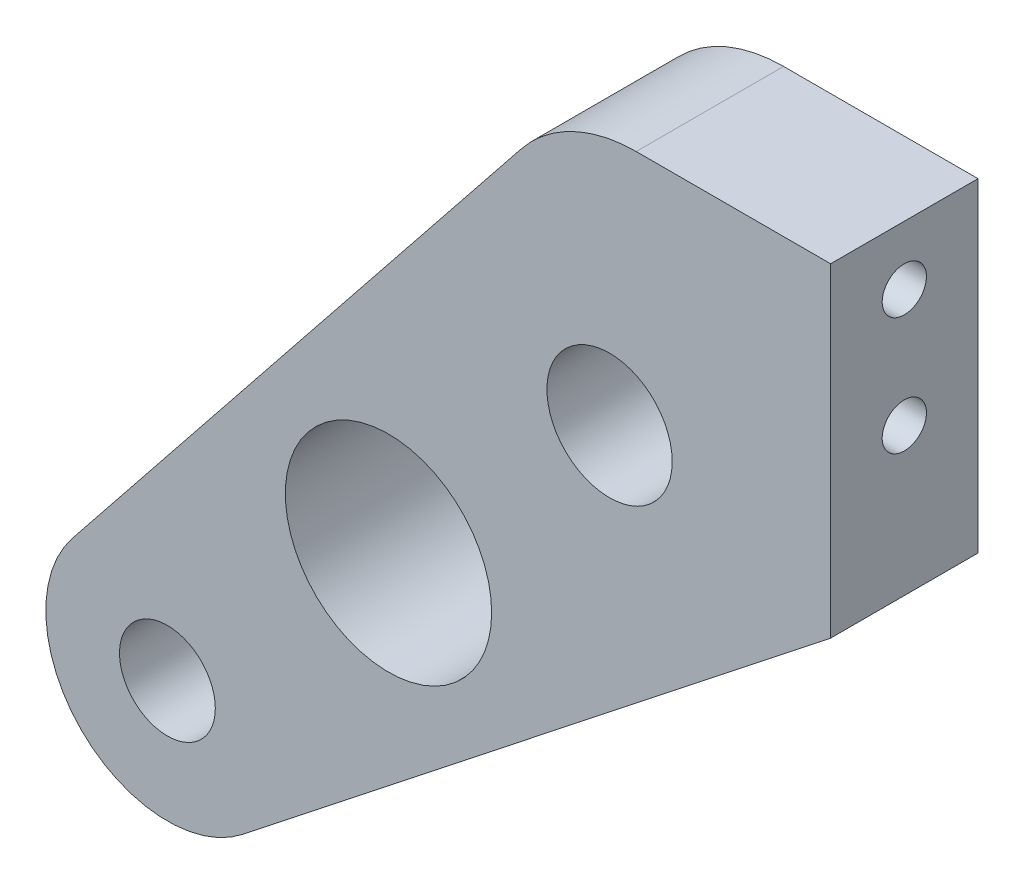
ISO-10303-21;
HEADER;
FILE_DESCRIPTION(('STEP AP214'),'2;1');
FILE_NAME('part.step','',(''),(''),'','','');
FILE_SCHEMA(('AUTOMOTIVE_DESIGN { 1 0 10303 214 1 1 1 1 }'));
ENDSEC;
DATA;
#1=APPLICATION_CONTEXT('core data for automotive mechanical design processes');
#2=APPLICATION_PROTOCOL_DEFINITION('international standard','automotive_design',2000,#1);
#3=PRODUCT_CONTEXT('',#1,'mechanical');
#4=PRODUCT('Part','Part','',(#3));
#5=PRODUCT_RELATED_PRODUCT_CATEGORY('part','',(#4));
#6=PRODUCT_DEFINITION_FORMATION('','',#4);
#7=PRODUCT_DEFINITION_CONTEXT('part definition',#1,'design');
#8=PRODUCT_DEFINITION('design','',#6,#7);
#9=PRODUCT_DEFINITION_SHAPE('','',#8);
#10=(LENGTH_UNIT() NAMED_UNIT(*) SI_UNIT(.MILLI.,.METRE.));
#11=(NAMED_UNIT(*) PLANE_ANGLE_UNIT() SI_UNIT($,.RADIAN.));
#12=(NAMED_UNIT(*) SI_UNIT($,.STERADIAN.) SOLID_ANGLE_UNIT());
#13=UNCERTAINTY_MEASURE_WITH_UNIT(LENGTH_MEASURE(1.E-05),#10,'distance_accuracy_value','');
#14=(GEOMETRIC_REPRESENTATION_CONTEXT(3) GLOBAL_UNCERTAINTY_ASSIGNED_CONTEXT((#13)) GLOBAL_UNIT_ASSIGNED_CONTEXT((#10,
#11,#12)) REPRESENTATION_CONTEXT('',''));
#15=CARTESIAN_POINT('',(0.,0.,0.));
#16=DIRECTION('',(0.,0.,1.));
#17=DIRECTION('',(1.,0.,0.));
#18=AXIS2_PLACEMENT_3D('',#15,#16,#17);
#19=CARTESIAN_POINT('',(0.,0.,10.));
#20=DIRECTION('',(0.,0.,1.));
#21=DIRECTION('',(1.,0.,0.));
#22=AXIS2_PLACEMENT_3D('',#19,#20,#21);
#23=PLANE('',#22);
#24=CARTESIAN_POINT('',(30.,30.,10.));
#25=DIRECTION('',(0.,0.,1.));
#26=DIRECTION('',(1.,0.,0.));
#27=AXIS2_PLACEMENT_3D('',#24,#25,#26);
#28=CIRCLE('',#27,4.25);
#29=CARTESIAN_POINT('',(34.25,30.,10.));
#30=VERTEX_POINT('',#29);
#31=EDGE_CURVE('E137',#30,#30,#28,.T.);
#32=ORIENTED_EDGE('',*,*,#31,.F.);
#33=EDGE_LOOP('',(#32));
#34=FACE_BOUND('',#33,.T.);
#35=DIRECTION('',(-1.,0.,0.));
#36=VECTOR('',#35,1.);
#37=CARTESIAN_POINT('',(45.,47.,10.));
#38=LINE('',#37,#36);
#39=CARTESIAN_POINT('',(45.,47.,10.));
#40=VERTEX_POINT('',#39);
#41=CARTESIAN_POINT('',(31.8093751344392,47.,10.));
#42=VERTEX_POINT('',#41);
#43=EDGE_CURVE('E131',#40,#42,#38,.T.);
#44=ORIENTED_EDGE('',*,*,#43,.T.);
#45=CARTESIAN_POINT('',(31.8093751344392,37.,10.));
#46=DIRECTION('',(0.,0.,1.));
#47=DIRECTION('',(1.,0.,0.));
#48=AXIS2_PLACEMENT_3D('',#45,#46,#47);
#49=CIRCLE('',#48,10.);
#50=CARTESIAN_POINT('',(23.9975150662449,43.2429834434308,10.));
#51=VERTEX_POINT('',#50);
#52=EDGE_CURVE('E11',#42,#51,#49,.T.);
#53=ORIENTED_EDGE('',*,*,#52,.T.);
#54=DIRECTION('',(-0.624298344343079,-0.781186006819433,0.));
#55=VECTOR('',#54,1.);
#56=CARTESIAN_POINT('',(27.,47.,10.));
#57=LINE('',#56,#55);
#58=CARTESIAN_POINT('',(-6.44478455626033,5.1504613408304,10.));
#59=VERTEX_POINT('',#58);
#60=EDGE_CURVE('E100',#51,#59,#57,.T.);
#61=ORIENTED_EDGE('',*,*,#60,.T.);
#62=CARTESIAN_POINT('',(0.,0.,10.));
#63=DIRECTION('',(0.,0.,1.));
#64=DIRECTION('',(1.,0.,0.));
#65=AXIS2_PLACEMENT_3D('',#62,#63,#64);
#66=CIRCLE('',#65,8.25);
#67=CARTESIAN_POINT('',(5.11054570549005,-6.4764822698821,10.));
#68=VERTEX_POINT('',#67);
#69=EDGE_CURVE('E95',#59,#68,#66,.T.);
#70=ORIENTED_EDGE('',*,*,#69,.T.);
#71=DIRECTION('',(0.785028153925103,0.619460085513946,0.));
#72=VECTOR('',#71,1.);
#73=CARTESIAN_POINT('',(5.11054570549005,-6.4764822698821,10.));
#74=LINE('',#73,#72);
#75=CARTESIAN_POINT('',(45.,25.,10.));
#76=VERTEX_POINT('',#75);
#77=EDGE_CURVE('E84',#68,#76,#74,.T.);
#78=ORIENTED_EDGE('',*,*,#77,.T.);
#79=DIRECTION('',(0.,1.,0.));
#80=VECTOR('',#79,1.);
#81=CARTESIAN_POINT('',(45.,25.,10.));
#82=LINE('',#81,#80);
#83=EDGE_CURVE('E94',#76,#40,#82,.T.);
#84=ORIENTED_EDGE('',*,*,#83,.T.);
#85=EDGE_LOOP('',(#44,#53,#61,#70,#78,#84));
#86=FACE_BOUND('',#85,.T.);
#87=CARTESIAN_POINT('',(0.,0.,10.));
#88=DIRECTION('',(0.,0.,1.));
#89=DIRECTION('',(1.,0.,0.));
#90=AXIS2_PLACEMENT_3D('',#87,#88,#89);
#91=CIRCLE('',#90,3.25);
#92=CARTESIAN_POINT('',(3.25,0.,10.));
#93=VERTEX_POINT('',#92);
#94=EDGE_CURVE('E129',#93,#93,#91,.T.);
#95=ORIENTED_EDGE('',*,*,#94,.F.);
#96=EDGE_LOOP('',(#95));
#97=FACE_BOUND('',#96,.T.);
#98=CARTESIAN_POINT('',(15.,15.,10.));
#99=DIRECTION('',(0.,0.,1.));
#100=DIRECTION('',(1.,0.,0.));
#101=AXIS2_PLACEMENT_3D('',#98,#99,#100);
#102=CIRCLE('',#101,7.);
#103=CARTESIAN_POINT('',(22.,15.,10.));
#104=VERTEX_POINT('',#103);
#105=EDGE_CURVE('E143',#104,#104,#102,.T.);
#106=ORIENTED_EDGE('',*,*,#105,.F.);
#107=EDGE_LOOP('',(#106));
#108=FACE_BOUND('',#107,.T.);
#109=ADVANCED_FACE('F31',(#34,#86,#97,#108),#23,.T.);
#110=CARTESIAN_POINT('',(0.,0.,0.));
#111=DIRECTION('',(0.,0.,1.));
#112=DIRECTION('',(1.,0.,0.));
#113=AXIS2_PLACEMENT_3D('',#110,#111,#112);
#114=PLANE('',#113);
#115=CARTESIAN_POINT('',(30.,30.,0.));
#116=DIRECTION('',(0.,0.,1.));
#117=DIRECTION('',(1.,0.,0.));
#118=AXIS2_PLACEMENT_3D('',#115,#116,#117);
#119=CIRCLE('',#118,4.25);
#120=CARTESIAN_POINT('',(34.25,30.,0.));
#121=VERTEX_POINT('',#120);
#122=EDGE_CURVE('E140',#121,#121,#119,.T.);
#123=ORIENTED_EDGE('',*,*,#122,.T.);
#124=EDGE_LOOP('',(#123));
#125=FACE_BOUND('',#124,.T.);
#126=DIRECTION('',(-0.624298344343079,-0.781186006819433,0.));
#127=VECTOR('',#126,1.);
#128=CARTESIAN_POINT('',(27.,47.,0.));
#129=LINE('',#128,#127);
#130=CARTESIAN_POINT('',(23.9975150662449,43.2429834434308,0.));
#131=VERTEX_POINT('',#130);
#132=CARTESIAN_POINT('',(-6.44478455626033,5.1504613408304,0.));
#133=VERTEX_POINT('',#132);
#134=EDGE_CURVE('E104',#131,#133,#129,.T.);
#135=ORIENTED_EDGE('',*,*,#134,.F.);
#136=CARTESIAN_POINT('',(31.8093751344392,37.,0.));
#137=DIRECTION('',(0.,0.,1.));
#138=DIRECTION('',(1.,0.,0.));
#139=AXIS2_PLACEMENT_3D('',#136,#137,#138);
#140=CIRCLE('',#139,10.);
#141=CARTESIAN_POINT('',(31.8093751344392,47.,0.));
#142=VERTEX_POINT('',#141);
#143=EDGE_CURVE('E53',#131,#142,#140,.F.);
#144=ORIENTED_EDGE('',*,*,#143,.T.);
#145=DIRECTION('',(-1.,0.,0.));
#146=VECTOR('',#145,1.);
#147=CARTESIAN_POINT('',(45.,47.,0.));
#148=LINE('',#147,#146);
#149=CARTESIAN_POINT('',(45.,47.,0.));
#150=VERTEX_POINT('',#149);
#151=EDGE_CURVE('E122',#150,#142,#148,.T.);
#152=ORIENTED_EDGE('',*,*,#151,.F.);
#153=DIRECTION('',(0.,1.,0.));
#154=VECTOR('',#153,1.);
#155=CARTESIAN_POINT('',(45.,25.,0.));
#156=LINE('',#155,#154);
#157=CARTESIAN_POINT('',(45.,25.,0.));
#158=VERTEX_POINT('',#157);
#159=EDGE_CURVE('E124',#158,#150,#156,.T.);
#160=ORIENTED_EDGE('',*,*,#159,.F.);
#161=DIRECTION('',(0.785028153925103,0.619460085513946,0.));
#162=VECTOR('',#161,1.);
#163=CARTESIAN_POINT('',(5.11054570549005,-6.4764822698821,0.));
#164=LINE('',#163,#162);
#165=CARTESIAN_POINT('',(5.11054570549005,-6.4764822698821,0.));
#166=VERTEX_POINT('',#165);
#167=EDGE_CURVE('E126',#166,#158,#164,.T.);
#168=ORIENTED_EDGE('',*,*,#167,.F.);
#169=CARTESIAN_POINT('',(0.,0.,0.));
#170=DIRECTION('',(0.,0.,1.));
#171=DIRECTION('',(1.,0.,0.));
#172=AXIS2_PLACEMENT_3D('',#169,#170,#171);
#173=CIRCLE('',#172,8.25);
#174=EDGE_CURVE('E108',#133,#166,#173,.T.);
#175=ORIENTED_EDGE('',*,*,#174,.F.);
#176=EDGE_LOOP('',(#135,#144,#152,#160,#168,#175));
#177=FACE_BOUND('',#176,.T.);
#178=CARTESIAN_POINT('',(0.,0.,0.));
#179=DIRECTION('',(0.,0.,1.));
#180=DIRECTION('',(1.,0.,0.));
#181=AXIS2_PLACEMENT_3D('',#178,#179,#180);
#182=CIRCLE('',#181,3.25);
#183=CARTESIAN_POINT('',(3.25,0.,0.));
#184=VERTEX_POINT('',#183);
#185=EDGE_CURVE('E134',#184,#184,#182,.T.);
#186=ORIENTED_EDGE('',*,*,#185,.T.);
#187=EDGE_LOOP('',(#186));
#188=FACE_BOUND('',#187,.T.);
#189=CARTESIAN_POINT('',(15.,15.,0.));
#190=DIRECTION('',(0.,0.,1.));
#191=DIRECTION('',(1.,0.,0.));
#192=AXIS2_PLACEMENT_3D('',#189,#190,#191);
#193=CIRCLE('',#192,7.);
#194=CARTESIAN_POINT('',(22.,15.,0.));
#195=VERTEX_POINT('',#194);
#196=EDGE_CURVE('E146',#195,#195,#193,.T.);
#197=ORIENTED_EDGE('',*,*,#196,.T.);
#198=EDGE_LOOP('',(#197));
#199=FACE_BOUND('',#198,.T.);
#200=ADVANCED_FACE('F182',(#125,#177,#188,#199),#114,.F.);
#201=CARTESIAN_POINT('',(0.,0.,10.));
#202=DIRECTION('',(0.,0.,-1.));
#203=DIRECTION('',(-1.,0.,0.));
#204=AXIS2_PLACEMENT_3D('',#201,#202,#203);
#205=CYLINDRICAL_SURFACE('',#204,8.25);
#206=ORIENTED_EDGE('',*,*,#174,.T.);
#207=DIRECTION('',(0.,0.,-1.));
#208=VECTOR('',#207,1.);
#209=CARTESIAN_POINT('',(5.11054570549005,-6.4764822698821,10.));
#210=LINE('',#209,#208);
#211=EDGE_CURVE('E88',#68,#166,#210,.T.);
#212=ORIENTED_EDGE('',*,*,#211,.F.);
#213=ORIENTED_EDGE('',*,*,#69,.F.);
#214=DIRECTION('',(0.,0.,-1.));
#215=VECTOR('',#214,1.);
#216=CARTESIAN_POINT('',(-6.44478455626033,5.1504613408304,10.));
#217=LINE('',#216,#215);
#218=EDGE_CURVE('E119',#59,#133,#217,.T.);
#219=ORIENTED_EDGE('',*,*,#218,.T.);
#220=EDGE_LOOP('',(#206,#212,#213,#219));
#221=FACE_BOUND('',#220,.T.);
#222=ADVANCED_FACE('F106',(#221),#205,.T.);
#223=CARTESIAN_POINT('',(5.11054570549005,-6.4764822698821,10.));
#224=DIRECTION('',(-0.619460085513946,0.785028153925103,0.));
#225=DIRECTION('',(-0.785028153925103,-0.619460085513946,0.));
#226=AXIS2_PLACEMENT_3D('',#223,#224,#225);
#227=PLANE('',#226);
#228=ORIENTED_EDGE('',*,*,#167,.T.);
#229=DIRECTION('',(0.,0.,-1.));
#230=VECTOR('',#229,1.);
#231=CARTESIAN_POINT('',(45.,25.,10.));
#232=LINE('',#231,#230);
#233=EDGE_CURVE('E91',#76,#158,#232,.T.);
#234=ORIENTED_EDGE('',*,*,#233,.F.);
#235=ORIENTED_EDGE('',*,*,#77,.F.);
#236=ORIENTED_EDGE('',*,*,#211,.T.);
#237=EDGE_LOOP('',(#228,#234,#235,#236));
#238=FACE_BOUND('',#237,.T.);
#239=ADVANCED_FACE('F86',(#238),#227,.F.);
#240=CARTESIAN_POINT('',(45.,25.,10.));
#241=DIRECTION('',(-1.,0.,0.));
#242=DIRECTION('',(0.,0.,1.));
#243=AXIS2_PLACEMENT_3D('',#240,#241,#242);
#244=PLANE('',#243);
#245=CARTESIAN_POINT('',(45.,35.,5.));
#246=DIRECTION('',(1.,0.,0.));
#247=DIRECTION('',(0.,0.,-1.));
#248=AXIS2_PLACEMENT_3D('',#245,#246,#247);
#249=CIRCLE('',#248,1.5);
#250=CARTESIAN_POINT('',(45.,35.,3.5));
#251=VERTEX_POINT('',#250);
#252=EDGE_CURVE('E158',#251,#251,#249,.T.);
#253=ORIENTED_EDGE('',*,*,#252,.F.);
#254=EDGE_LOOP('',(#253));
#255=FACE_BOUND('',#254,.T.);
#256=CARTESIAN_POINT('',(45.,43.,5.));
#257=DIRECTION('',(1.,0.,0.));
#258=DIRECTION('',(0.,0.,-1.));
#259=AXIS2_PLACEMENT_3D('',#256,#257,#258);
#260=CIRCLE('',#259,1.5);
#261=CARTESIAN_POINT('',(45.,43.,3.5));
#262=VERTEX_POINT('',#261);
#263=EDGE_CURVE('E152',#262,#262,#260,.T.);
#264=ORIENTED_EDGE('',*,*,#263,.F.);
#265=EDGE_LOOP('',(#264));
#266=FACE_BOUND('',#265,.T.);
#267=ORIENTED_EDGE('',*,*,#159,.T.);
#268=DIRECTION('',(0.,0.,-1.));
#269=VECTOR('',#268,1.);
#270=CARTESIAN_POINT('',(45.,47.,10.));
#271=LINE('',#270,#269);
#272=EDGE_CURVE('E113',#40,#150,#271,.T.);
#273=ORIENTED_EDGE('',*,*,#272,.F.);
#274=ORIENTED_EDGE('',*,*,#83,.F.);
#275=ORIENTED_EDGE('',*,*,#233,.T.);
#276=EDGE_LOOP('',(#267,#273,#274,#275));
#277=FACE_BOUND('',#276,.T.);
#278=ADVANCED_FACE('F173',(#255,#266,#277),#244,.F.);
#279=CARTESIAN_POINT('',(45.,47.,10.));
#280=DIRECTION('',(0.,-1.,0.));
#281=DIRECTION('',(0.,0.,-1.));
#282=AXIS2_PLACEMENT_3D('',#279,#280,#281);
#283=PLANE('',#282);
#284=ORIENTED_EDGE('',*,*,#151,.T.);
#285=DIRECTION('',(0.,0.,-1.));
#286=VECTOR('',#285,1.);
#287=CARTESIAN_POINT('',(31.8093751344392,47.,10.));
#288=LINE('',#287,#286);
#289=EDGE_CURVE('E39',#142,#42,#288,.F.);
#290=ORIENTED_EDGE('',*,*,#289,.T.);
#291=ORIENTED_EDGE('',*,*,#43,.F.);
#292=ORIENTED_EDGE('',*,*,#272,.T.);
#293=EDGE_LOOP('',(#284,#290,#291,#292));
#294=FACE_BOUND('',#293,.T.);
#295=ADVANCED_FACE('F176',(#294),#283,.F.);
#296=CARTESIAN_POINT('',(27.,47.,10.));
#297=DIRECTION('',(0.781186006819433,-0.624298344343079,0.));
#298=DIRECTION('',(0.624298344343079,0.781186006819433,0.));
#299=AXIS2_PLACEMENT_3D('',#296,#297,#298);
#300=PLANE('',#299);
#301=ORIENTED_EDGE('',*,*,#60,.F.);
#302=DIRECTION('',(0.,0.,-1.));
#303=VECTOR('',#302,1.);
#304=CARTESIAN_POINT('',(23.9975150662448,43.2429834434308,10.));
#305=LINE('',#304,#303);
#306=EDGE_CURVE('E109',#51,#131,#305,.T.);
#307=ORIENTED_EDGE('',*,*,#306,.T.);
#308=ORIENTED_EDGE('',*,*,#134,.T.);
#309=ORIENTED_EDGE('',*,*,#218,.F.);
#310=EDGE_LOOP('',(#301,#307,#308,#309));
#311=FACE_BOUND('',#310,.T.);
#312=ADVANCED_FACE('F214',(#311),#300,.F.);
#313=CARTESIAN_POINT('',(0.,0.,10.));
#314=DIRECTION('',(0.,0.,-1.));
#315=DIRECTION('',(-1.,0.,0.));
#316=AXIS2_PLACEMENT_3D('',#313,#314,#315);
#317=CYLINDRICAL_SURFACE('',#316,3.25);
#318=ORIENTED_EDGE('',*,*,#94,.T.);
#319=EDGE_LOOP('',(#318));
#320=FACE_BOUND('',#319,.T.);
#321=ORIENTED_EDGE('',*,*,#185,.F.);
#322=EDGE_LOOP('',(#321));
#323=FACE_BOUND('',#322,.T.);
#324=ADVANCED_FACE('F203',(#320,#323),#317,.F.);
#325=CARTESIAN_POINT('',(30.,30.,10.));
#326=DIRECTION('',(0.,0.,-1.));
#327=DIRECTION('',(-1.,0.,0.));
#328=AXIS2_PLACEMENT_3D('',#325,#326,#327);
#329=CYLINDRICAL_SURFACE('',#328,4.25);
#330=ORIENTED_EDGE('',*,*,#31,.T.);
#331=EDGE_LOOP('',(#330));
#332=FACE_BOUND('',#331,.T.);
#333=ORIENTED_EDGE('',*,*,#122,.F.);
#334=EDGE_LOOP('',(#333));
#335=FACE_BOUND('',#334,.T.);
#336=ADVANCED_FACE('F194',(#332,#335),#329,.F.);
#337=CARTESIAN_POINT('',(15.,15.,10.));
#338=DIRECTION('',(0.,0.,-1.));
#339=DIRECTION('',(-1.,0.,0.));
#340=AXIS2_PLACEMENT_3D('',#337,#338,#339);
#341=CYLINDRICAL_SURFACE('',#340,7.);
#342=ORIENTED_EDGE('',*,*,#105,.T.);
#343=EDGE_LOOP('',(#342));
#344=FACE_BOUND('',#343,.T.);
#345=ORIENTED_EDGE('',*,*,#196,.F.);
#346=EDGE_LOOP('',(#345));
#347=FACE_BOUND('',#346,.T.);
#348=ADVANCED_FACE('F191',(#344,#347),#341,.F.);
#349=CARTESIAN_POINT('',(35.,43.,5.));
#350=DIRECTION('',(1.,0.,0.));
#351=DIRECTION('',(0.,0.,-1.));
#352=AXIS2_PLACEMENT_3D('',#349,#350,#351);
#353=CYLINDRICAL_SURFACE('',#352,1.5);
#354=CARTESIAN_POINT('',(35.,43.,5.));
#355=DIRECTION('',(1.,0.,0.));
#356=DIRECTION('',(0.,0.,-1.));
#357=AXIS2_PLACEMENT_3D('',#354,#355,#356);
#358=CIRCLE('',#357,1.5);
#359=CARTESIAN_POINT('',(35.,43.,3.5));
#360=VERTEX_POINT('',#359);
#361=EDGE_CURVE('E149',#360,#360,#358,.T.);
#362=ORIENTED_EDGE('',*,*,#361,.F.);
#363=EDGE_LOOP('',(#362));
#364=FACE_BOUND('',#363,.T.);
#365=ORIENTED_EDGE('',*,*,#263,.T.);
#366=EDGE_LOOP('',(#365));
#367=FACE_BOUND('',#366,.T.);
#368=ADVANCED_FACE('F193',(#364,#367),#353,.F.);
#369=CARTESIAN_POINT('',(35.,43.,5.));
#370=DIRECTION('',(1.,0.,0.));
#371=DIRECTION('',(0.,0.,-1.));
#372=AXIS2_PLACEMENT_3D('',#369,#370,#371);
#373=PLANE('',#372);
#374=ORIENTED_EDGE('',*,*,#361,.T.);
#375=EDGE_LOOP('',(#374));
#376=FACE_BOUND('',#375,.T.);
#377=ADVANCED_FACE('F169',(#376),#373,.T.);
#378=CARTESIAN_POINT('',(35.,35.,5.));
#379=DIRECTION('',(1.,0.,0.));
#380=DIRECTION('',(0.,0.,-1.));
#381=AXIS2_PLACEMENT_3D('',#378,#379,#380);
#382=CYLINDRICAL_SURFACE('',#381,1.5);
#383=CARTESIAN_POINT('',(35.,35.,5.));
#384=DIRECTION('',(1.,0.,0.));
#385=DIRECTION('',(0.,0.,-1.));
#386=AXIS2_PLACEMENT_3D('',#383,#384,#385);
#387=CIRCLE('',#386,1.5);
#388=CARTESIAN_POINT('',(35.,35.,3.5));
#389=VERTEX_POINT('',#388);
#390=EDGE_CURVE('E155',#389,#389,#387,.T.);
#391=ORIENTED_EDGE('',*,*,#390,.F.);
#392=EDGE_LOOP('',(#391));
#393=FACE_BOUND('',#392,.T.);
#394=ORIENTED_EDGE('',*,*,#252,.T.);
#395=EDGE_LOOP('',(#394));
#396=FACE_BOUND('',#395,.T.);
#397=ADVANCED_FACE('F166',(#393,#396),#382,.F.);
#398=CARTESIAN_POINT('',(35.,35.,5.));
#399=DIRECTION('',(1.,0.,0.));
#400=DIRECTION('',(0.,0.,-1.));
#401=AXIS2_PLACEMENT_3D('',#398,#399,#400);
#402=PLANE('',#401);
#403=ORIENTED_EDGE('',*,*,#390,.T.);
#404=EDGE_LOOP('',(#403));
#405=FACE_BOUND('',#404,.T.);
#406=ADVANCED_FACE('F164',(#405),#402,.T.);
#407=CARTESIAN_POINT('',(31.8093751344392,37.,10.));
#408=DIRECTION('',(0.,0.,-1.));
#409=DIRECTION('',(-1.,0.,0.));
#410=AXIS2_PLACEMENT_3D('',#407,#408,#409);
#411=CYLINDRICAL_SURFACE('',#410,10.);
#412=ORIENTED_EDGE('',*,*,#52,.F.);
#413=ORIENTED_EDGE('',*,*,#289,.F.);
#414=ORIENTED_EDGE('',*,*,#143,.F.);
#415=ORIENTED_EDGE('',*,*,#306,.F.);
#416=EDGE_LOOP('',(#412,#413,#414,#415));
#417=FACE_BOUND('',#416,.T.);
#418=ADVANCED_FACE('F33',(#417),#411,.T.);
#419=CLOSED_SHELL('',(#109,#200,#222,#239,#278,#295,#312,#324,#336,#348,#368,#377,#397,#406,#418));
#420=MANIFOLD_SOLID_BREP('B2',#419);
#421=ADVANCED_BREP_SHAPE_REPRESENTATION('',(#18,#420),#14);
#422=SHAPE_DEFINITION_REPRESENTATION(#9,#421);
ENDSEC;
END-ISO-10303-21;
